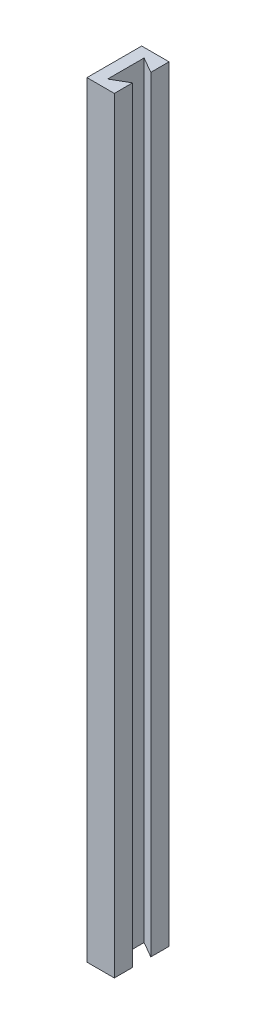
ISO-10303-21;
HEADER;
FILE_DESCRIPTION(('STEP AP214'),'2;1');
FILE_NAME('part.step','',(''),(''),'','','');
FILE_SCHEMA(('AUTOMOTIVE_DESIGN { 1 0 10303 214 1 1 1 1 }'));
ENDSEC;
DATA;
#1=APPLICATION_CONTEXT('core data for automotive mechanical design processes');
#2=APPLICATION_PROTOCOL_DEFINITION('international standard','automotive_design',2000,#1);
#3=PRODUCT_CONTEXT('',#1,'mechanical');
#4=PRODUCT('Part','Part','',(#3));
#5=PRODUCT_RELATED_PRODUCT_CATEGORY('part','',(#4));
#6=PRODUCT_DEFINITION_FORMATION('','',#4);
#7=PRODUCT_DEFINITION_CONTEXT('part definition',#1,'design');
#8=PRODUCT_DEFINITION('design','',#6,#7);
#9=PRODUCT_DEFINITION_SHAPE('','',#8);
#10=(LENGTH_UNIT() NAMED_UNIT(*) SI_UNIT(.MILLI.,.METRE.));
#11=(NAMED_UNIT(*) PLANE_ANGLE_UNIT() SI_UNIT($,.RADIAN.));
#12=(NAMED_UNIT(*) SI_UNIT($,.STERADIAN.) SOLID_ANGLE_UNIT());
#13=UNCERTAINTY_MEASURE_WITH_UNIT(LENGTH_MEASURE(1.E-05),#10,'distance_accuracy_value','');
#14=(GEOMETRIC_REPRESENTATION_CONTEXT(3) GLOBAL_UNCERTAINTY_ASSIGNED_CONTEXT((#13)) GLOBAL_UNIT_ASSIGNED_CONTEXT((#10,
#11,#12)) REPRESENTATION_CONTEXT('',''));
#15=CARTESIAN_POINT('',(0.,0.,0.));
#16=DIRECTION('',(0.,0.,1.));
#17=DIRECTION('',(1.,0.,0.));
#18=AXIS2_PLACEMENT_3D('',#15,#16,#17);
#19=CARTESIAN_POINT('',(-28.0675799086758,355.6,0.));
#20=DIRECTION('',(0.,0.,-1.));
#21=DIRECTION('',(-1.,0.,0.));
#22=AXIS2_PLACEMENT_3D('',#19,#20,#21);
#23=PLANE('',#22);
#24=DIRECTION('',(1.,0.,0.));
#25=VECTOR('',#24,1.);
#26=CARTESIAN_POINT('',(-28.0675799086758,0.,0.));
#27=LINE('',#26,#25);
#28=CARTESIAN_POINT('',(-28.0675799086758,0.,0.));
#29=VERTEX_POINT('',#28);
#30=CARTESIAN_POINT('',(-15.3675799086758,0.,0.));
#31=VERTEX_POINT('',#30);
#32=EDGE_CURVE('E130',#29,#31,#27,.T.);
#33=ORIENTED_EDGE('',*,*,#32,.F.);
#34=DIRECTION('',(0.,-1.,0.));
#35=VECTOR('',#34,1.);
#36=CARTESIAN_POINT('',(-28.0675799086758,355.6,0.));
#37=LINE('',#36,#35);
#38=CARTESIAN_POINT('',(-28.0675799086758,355.6,0.));
#39=VERTEX_POINT('',#38);
#40=EDGE_CURVE('E11',#39,#29,#37,.T.);
#41=ORIENTED_EDGE('',*,*,#40,.F.);
#42=DIRECTION('',(1.,0.,0.));
#43=VECTOR('',#42,1.);
#44=CARTESIAN_POINT('',(-28.0675799086758,355.6,0.));
#45=LINE('',#44,#43);
#46=CARTESIAN_POINT('',(-15.3675799086758,355.6,0.));
#47=VERTEX_POINT('',#46);
#48=EDGE_CURVE('E148',#39,#47,#45,.T.);
#49=ORIENTED_EDGE('',*,*,#48,.T.);
#50=DIRECTION('',(0.,-1.,0.));
#51=VECTOR('',#50,1.);
#52=CARTESIAN_POINT('',(-15.3675799086758,355.6,0.));
#53=LINE('',#52,#51);
#54=EDGE_CURVE('E38',#47,#31,#53,.T.);
#55=ORIENTED_EDGE('',*,*,#54,.T.);
#56=EDGE_LOOP('',(#33,#41,#49,#55));
#57=FACE_BOUND('',#56,.T.);
#58=ADVANCED_FACE('F35',(#57),#23,.T.);
#59=CARTESIAN_POINT('',(-28.0675799086758,355.6,0.));
#60=DIRECTION('',(1.,0.,0.));
#61=DIRECTION('',(0.,0.,-1.));
#62=AXIS2_PLACEMENT_3D('',#59,#60,#61);
#63=PLANE('',#62);
#64=DIRECTION('',(0.,0.,1.));
#65=VECTOR('',#64,1.);
#66=CARTESIAN_POINT('',(-28.0675799086758,0.,0.));
#67=LINE('',#66,#65);
#68=CARTESIAN_POINT('',(-28.0675799086758,0.,25.4));
#69=VERTEX_POINT('',#68);
#70=EDGE_CURVE('E147',#29,#69,#67,.T.);
#71=ORIENTED_EDGE('',*,*,#70,.T.);
#72=DIRECTION('',(0.,-1.,0.));
#73=VECTOR('',#72,1.);
#74=CARTESIAN_POINT('',(-28.0675799086758,355.6,25.4));
#75=LINE('',#74,#73);
#76=CARTESIAN_POINT('',(-28.0675799086758,355.6,25.4));
#77=VERTEX_POINT('',#76);
#78=EDGE_CURVE('E44',#77,#69,#75,.T.);
#79=ORIENTED_EDGE('',*,*,#78,.F.);
#80=DIRECTION('',(0.,0.,1.));
#81=VECTOR('',#80,1.);
#82=CARTESIAN_POINT('',(-28.0675799086758,355.6,0.));
#83=LINE('',#82,#81);
#84=EDGE_CURVE('E125',#39,#77,#83,.T.);
#85=ORIENTED_EDGE('',*,*,#84,.F.);
#86=ORIENTED_EDGE('',*,*,#40,.T.);
#87=EDGE_LOOP('',(#71,#79,#85,#86));
#88=FACE_BOUND('',#87,.T.);
#89=ADVANCED_FACE('F161',(#88),#63,.F.);
#90=CARTESIAN_POINT('',(-15.3675799086758,355.6,25.4));
#91=DIRECTION('',(0.,0.,1.));
#92=DIRECTION('',(1.,0.,0.));
#93=AXIS2_PLACEMENT_3D('',#90,#91,#92);
#94=PLANE('',#93);
#95=DIRECTION('',(-1.,0.,0.));
#96=VECTOR('',#95,1.);
#97=CARTESIAN_POINT('',(-15.3675799086758,0.,25.4));
#98=LINE('',#97,#96);
#99=CARTESIAN_POINT('',(-15.3675799086758,0.,25.4));
#100=VERTEX_POINT('',#99);
#101=EDGE_CURVE('E110',#100,#69,#98,.T.);
#102=ORIENTED_EDGE('',*,*,#101,.F.);
#103=DIRECTION('',(0.,-1.,0.));
#104=VECTOR('',#103,1.);
#105=CARTESIAN_POINT('',(-15.3675799086758,355.6,25.4));
#106=LINE('',#105,#104);
#107=CARTESIAN_POINT('',(-15.3675799086758,355.6,25.4));
#108=VERTEX_POINT('',#107);
#109=EDGE_CURVE('E104',#108,#100,#106,.T.);
#110=ORIENTED_EDGE('',*,*,#109,.F.);
#111=DIRECTION('',(-1.,0.,0.));
#112=VECTOR('',#111,1.);
#113=CARTESIAN_POINT('',(-15.3675799086758,355.6,25.4));
#114=LINE('',#113,#112);
#115=EDGE_CURVE('E108',#108,#77,#114,.T.);
#116=ORIENTED_EDGE('',*,*,#115,.T.);
#117=ORIENTED_EDGE('',*,*,#78,.T.);
#118=EDGE_LOOP('',(#102,#110,#116,#117));
#119=FACE_BOUND('',#118,.T.);
#120=ADVANCED_FACE('F106',(#119),#94,.T.);
#121=CARTESIAN_POINT('',(-15.3675799086758,355.6,25.4));
#122=DIRECTION('',(-1.,0.,0.));
#123=DIRECTION('',(0.,0.,1.));
#124=AXIS2_PLACEMENT_3D('',#121,#122,#123);
#125=PLANE('',#124);
#126=DIRECTION('',(0.,0.,-1.));
#127=VECTOR('',#126,1.);
#128=CARTESIAN_POINT('',(-15.3675799086758,0.,25.4));
#129=LINE('',#128,#127);
#130=CARTESIAN_POINT('',(-15.3675799086758,0.,16.9333333333333));
#131=VERTEX_POINT('',#130);
#132=EDGE_CURVE('E144',#100,#131,#129,.T.);
#133=ORIENTED_EDGE('',*,*,#132,.T.);
#134=DIRECTION('',(0.,-1.,0.));
#135=VECTOR('',#134,1.);
#136=CARTESIAN_POINT('',(-15.3675799086758,355.6,16.9333333333333));
#137=LINE('',#136,#135);
#138=CARTESIAN_POINT('',(-15.3675799086758,355.6,16.9333333333333));
#139=VERTEX_POINT('',#138);
#140=EDGE_CURVE('E113',#139,#131,#137,.T.);
#141=ORIENTED_EDGE('',*,*,#140,.F.);
#142=DIRECTION('',(0.,0.,-1.));
#143=VECTOR('',#142,1.);
#144=CARTESIAN_POINT('',(-15.3675799086758,355.6,25.4));
#145=LINE('',#144,#143);
#146=EDGE_CURVE('E116',#108,#139,#145,.T.);
#147=ORIENTED_EDGE('',*,*,#146,.F.);
#148=ORIENTED_EDGE('',*,*,#109,.T.);
#149=EDGE_LOOP('',(#133,#141,#147,#148));
#150=FACE_BOUND('',#149,.T.);
#151=ADVANCED_FACE('F117',(#150),#125,.F.);
#152=CARTESIAN_POINT('',(-15.3675799086758,355.6,16.9333333333333));
#153=DIRECTION('',(0.499999995000001,0.,0.86602540667119));
#154=DIRECTION('',(0.86602540667119,0.,-0.499999995000001));
#155=AXIS2_PLACEMENT_3D('',#152,#153,#154);
#156=PLANE('',#155);
#157=DIRECTION('',(-0.86602540667119,0.,0.499999995000001));
#158=VECTOR('',#157,1.);
#159=CARTESIAN_POINT('',(-15.3675799086758,0.,16.9333333333333));
#160=LINE('',#159,#158);
#161=CARTESIAN_POINT('',(-22.6999282785017,0.,21.166666582));
#162=VERTEX_POINT('',#161);
#163=EDGE_CURVE('E142',#131,#162,#160,.T.);
#164=ORIENTED_EDGE('',*,*,#163,.T.);
#165=DIRECTION('',(0.,-1.,0.));
#166=VECTOR('',#165,1.);
#167=CARTESIAN_POINT('',(-22.6999282785017,355.6,21.166666582));
#168=LINE('',#167,#166);
#169=CARTESIAN_POINT('',(-22.6999282785017,355.6,21.166666582));
#170=VERTEX_POINT('',#169);
#171=EDGE_CURVE('E152',#170,#162,#168,.T.);
#172=ORIENTED_EDGE('',*,*,#171,.F.);
#173=DIRECTION('',(-0.86602540667119,0.,0.499999995000001));
#174=VECTOR('',#173,1.);
#175=CARTESIAN_POINT('',(-15.3675799086758,355.6,16.9333333333333));
#176=LINE('',#175,#174);
#177=EDGE_CURVE('E121',#139,#170,#176,.T.);
#178=ORIENTED_EDGE('',*,*,#177,.F.);
#179=ORIENTED_EDGE('',*,*,#140,.T.);
#180=EDGE_LOOP('',(#164,#172,#178,#179));
#181=FACE_BOUND('',#180,.T.);
#182=ADVANCED_FACE('F175',(#181),#156,.F.);
#183=CARTESIAN_POINT('',(-22.6999282785017,355.6,21.166666582));
#184=DIRECTION('',(-1.,0.,0.));
#185=DIRECTION('',(0.,0.,1.));
#186=AXIS2_PLACEMENT_3D('',#183,#184,#185);
#187=PLANE('',#186);
#188=DIRECTION('',(0.,0.,-1.));
#189=VECTOR('',#188,1.);
#190=CARTESIAN_POINT('',(-22.6999282785017,0.,21.166666582));
#191=LINE('',#190,#189);
#192=CARTESIAN_POINT('',(-22.6999282785017,0.,4.23333324866667));
#193=VERTEX_POINT('',#192);
#194=EDGE_CURVE('E139',#162,#193,#191,.T.);
#195=ORIENTED_EDGE('',*,*,#194,.T.);
#196=DIRECTION('',(0.,-1.,0.));
#197=VECTOR('',#196,1.);
#198=CARTESIAN_POINT('',(-22.6999282785017,355.6,4.23333324866667));
#199=LINE('',#198,#197);
#200=CARTESIAN_POINT('',(-22.6999282785017,355.6,4.23333324866667));
#201=VERTEX_POINT('',#200);
#202=EDGE_CURVE('E155',#201,#193,#199,.T.);
#203=ORIENTED_EDGE('',*,*,#202,.F.);
#204=DIRECTION('',(0.,0.,-1.));
#205=VECTOR('',#204,1.);
#206=CARTESIAN_POINT('',(-22.6999282785017,355.6,21.166666582));
#207=LINE('',#206,#205);
#208=EDGE_CURVE('E170',#170,#201,#207,.T.);
#209=ORIENTED_EDGE('',*,*,#208,.F.);
#210=ORIENTED_EDGE('',*,*,#171,.T.);
#211=EDGE_LOOP('',(#195,#203,#209,#210));
#212=FACE_BOUND('',#211,.T.);
#213=ADVANCED_FACE('F179',(#212),#187,.F.);
#214=CARTESIAN_POINT('',(-15.3675799086758,355.6,8.46666666666667));
#215=DIRECTION('',(-0.500000009999999,0.,0.866025398010936));
#216=DIRECTION('',(0.866025398010936,0.,0.500000009999999));
#217=AXIS2_PLACEMENT_3D('',#214,#215,#216);
#218=PLANE('',#217);
#219=DIRECTION('',(-0.866025398010936,0.,-0.500000009999999));
#220=VECTOR('',#219,1.);
#221=CARTESIAN_POINT('',(-15.3675799086758,0.,8.46666666666667));
#222=LINE('',#221,#220);
#223=CARTESIAN_POINT('',(-15.3675799086758,0.,8.46666666666667));
#224=VERTEX_POINT('',#223);
#225=EDGE_CURVE('E136',#224,#193,#222,.T.);
#226=ORIENTED_EDGE('',*,*,#225,.F.);
#227=DIRECTION('',(0.,-1.,0.));
#228=VECTOR('',#227,1.);
#229=CARTESIAN_POINT('',(-15.3675799086758,355.6,8.46666666666667));
#230=LINE('',#229,#228);
#231=CARTESIAN_POINT('',(-15.3675799086758,355.6,8.46666666666667));
#232=VERTEX_POINT('',#231);
#233=EDGE_CURVE('E156',#232,#224,#230,.T.);
#234=ORIENTED_EDGE('',*,*,#233,.F.);
#235=DIRECTION('',(-0.866025398010936,0.,-0.500000009999999));
#236=VECTOR('',#235,1.);
#237=CARTESIAN_POINT('',(-15.3675799086758,355.6,8.46666666666667));
#238=LINE('',#237,#236);
#239=EDGE_CURVE('E165',#232,#201,#238,.T.);
#240=ORIENTED_EDGE('',*,*,#239,.T.);
#241=ORIENTED_EDGE('',*,*,#202,.T.);
#242=EDGE_LOOP('',(#226,#234,#240,#241));
#243=FACE_BOUND('',#242,.T.);
#244=ADVANCED_FACE('F181',(#243),#218,.T.);
#245=CARTESIAN_POINT('',(-15.3675799086758,355.6,0.));
#246=DIRECTION('',(1.,0.,0.));
#247=DIRECTION('',(0.,0.,-1.));
#248=AXIS2_PLACEMENT_3D('',#245,#246,#247);
#249=PLANE('',#248);
#250=DIRECTION('',(0.,0.,1.));
#251=VECTOR('',#250,1.);
#252=CARTESIAN_POINT('',(-15.3675799086758,0.,0.));
#253=LINE('',#252,#251);
#254=EDGE_CURVE('E133',#31,#224,#253,.T.);
#255=ORIENTED_EDGE('',*,*,#254,.F.);
#256=ORIENTED_EDGE('',*,*,#54,.F.);
#257=DIRECTION('',(0.,0.,1.));
#258=VECTOR('',#257,1.);
#259=CARTESIAN_POINT('',(-15.3675799086758,355.6,0.));
#260=LINE('',#259,#258);
#261=EDGE_CURVE('E163',#47,#232,#260,.T.);
#262=ORIENTED_EDGE('',*,*,#261,.T.);
#263=ORIENTED_EDGE('',*,*,#233,.T.);
#264=EDGE_LOOP('',(#255,#256,#262,#263));
#265=FACE_BOUND('',#264,.T.);
#266=ADVANCED_FACE('F158',(#265),#249,.T.);
#267=CARTESIAN_POINT('',(0.,355.6,0.));
#268=DIRECTION('',(0.,-1.,0.));
#269=DIRECTION('',(0.,0.,-1.));
#270=AXIS2_PLACEMENT_3D('',#267,#268,#269);
#271=PLANE('',#270);
#272=ORIENTED_EDGE('',*,*,#48,.F.);
#273=ORIENTED_EDGE('',*,*,#84,.T.);
#274=ORIENTED_EDGE('',*,*,#115,.F.);
#275=ORIENTED_EDGE('',*,*,#146,.T.);
#276=ORIENTED_EDGE('',*,*,#177,.T.);
#277=ORIENTED_EDGE('',*,*,#208,.T.);
#278=ORIENTED_EDGE('',*,*,#239,.F.);
#279=ORIENTED_EDGE('',*,*,#261,.F.);
#280=EDGE_LOOP('',(#272,#273,#274,#275,#276,#277,#278,#279));
#281=FACE_BOUND('',#280,.T.);
#282=ADVANCED_FACE('F124',(#281),#271,.F.);
#283=CARTESIAN_POINT('',(0.,0.,0.));
#284=DIRECTION('',(0.,-1.,0.));
#285=DIRECTION('',(0.,0.,-1.));
#286=AXIS2_PLACEMENT_3D('',#283,#284,#285);
#287=PLANE('',#286);
#288=ORIENTED_EDGE('',*,*,#32,.T.);
#289=ORIENTED_EDGE('',*,*,#254,.T.);
#290=ORIENTED_EDGE('',*,*,#225,.T.);
#291=ORIENTED_EDGE('',*,*,#194,.F.);
#292=ORIENTED_EDGE('',*,*,#163,.F.);
#293=ORIENTED_EDGE('',*,*,#132,.F.);
#294=ORIENTED_EDGE('',*,*,#101,.T.);
#295=ORIENTED_EDGE('',*,*,#70,.F.);
#296=EDGE_LOOP('',(#288,#289,#290,#291,#292,#293,#294,#295));
#297=FACE_BOUND('',#296,.T.);
#298=ADVANCED_FACE('F160',(#297),#287,.T.);
#299=CLOSED_SHELL('',(#58,#89,#120,#151,#182,#213,#244,#266,#282,#298));
#300=MANIFOLD_SOLID_BREP('B2',#299);
#301=ADVANCED_BREP_SHAPE_REPRESENTATION('',(#18,#300),#14);
#302=SHAPE_DEFINITION_REPRESENTATION(#9,#301);
ENDSEC;
END-ISO-10303-21;
